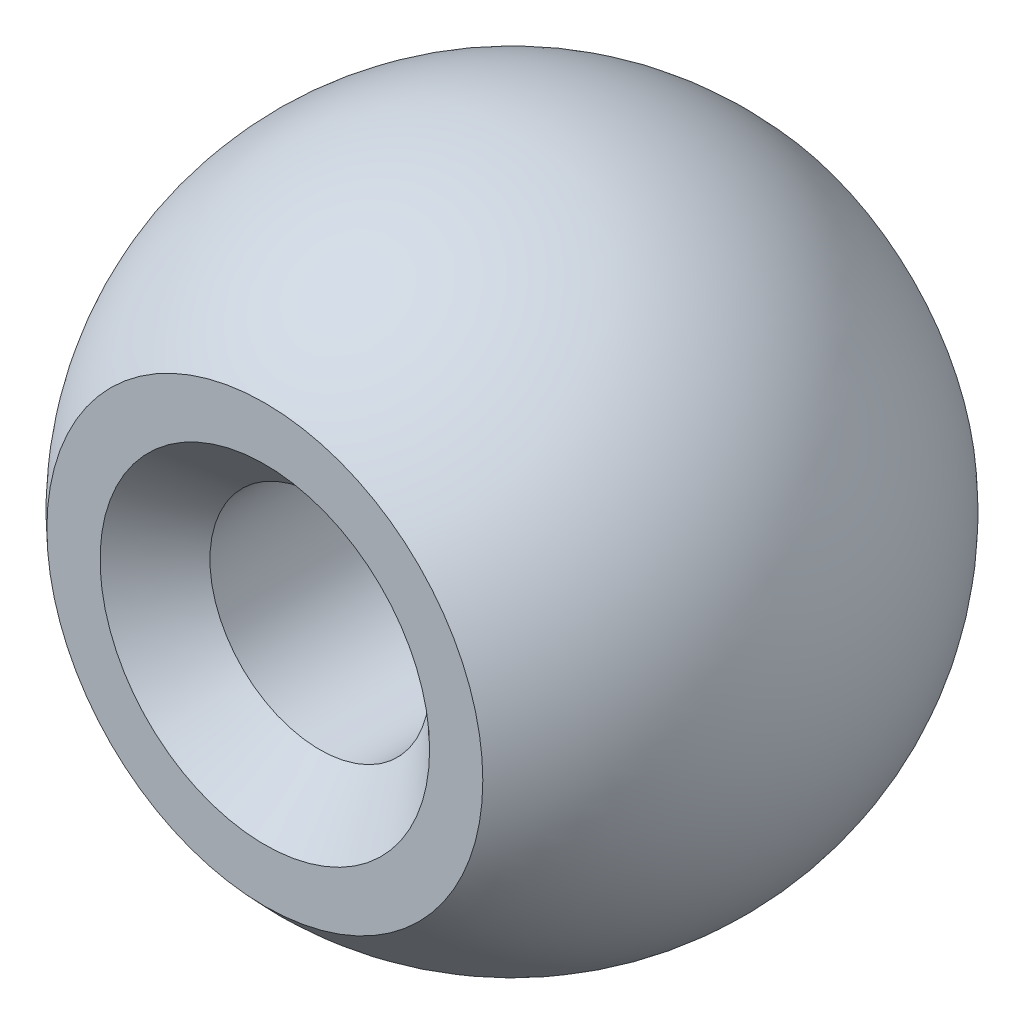
ISO-10303-21;
HEADER;
FILE_DESCRIPTION(('STEP AP214'),'2;1');
FILE_NAME('part.step','',(''),(''),'','','');
FILE_SCHEMA(('AUTOMOTIVE_DESIGN { 1 0 10303 214 1 1 1 1 }'));
ENDSEC;
DATA;
#1=APPLICATION_CONTEXT('core data for automotive mechanical design processes');
#2=APPLICATION_PROTOCOL_DEFINITION('international standard','automotive_design',2000,#1);
#3=PRODUCT_CONTEXT('',#1,'mechanical');
#4=PRODUCT('Part','Part','',(#3));
#5=PRODUCT_RELATED_PRODUCT_CATEGORY('part','',(#4));
#6=PRODUCT_DEFINITION_FORMATION('','',#4);
#7=PRODUCT_DEFINITION_CONTEXT('part definition',#1,'design');
#8=PRODUCT_DEFINITION('design','',#6,#7);
#9=PRODUCT_DEFINITION_SHAPE('','',#8);
#10=(LENGTH_UNIT() NAMED_UNIT(*) SI_UNIT(.MILLI.,.METRE.));
#11=(NAMED_UNIT(*) PLANE_ANGLE_UNIT() SI_UNIT($,.RADIAN.));
#12=(NAMED_UNIT(*) SI_UNIT($,.STERADIAN.) SOLID_ANGLE_UNIT());
#13=UNCERTAINTY_MEASURE_WITH_UNIT(LENGTH_MEASURE(1.E-05),#10,'distance_accuracy_value','');
#14=(GEOMETRIC_REPRESENTATION_CONTEXT(3) GLOBAL_UNCERTAINTY_ASSIGNED_CONTEXT((#13)) GLOBAL_UNIT_ASSIGNED_CONTEXT((#10,
#11,#12)) REPRESENTATION_CONTEXT('',''));
#15=CARTESIAN_POINT('',(0.,0.,0.));
#16=DIRECTION('',(0.,0.,1.));
#17=DIRECTION('',(1.,0.,0.));
#18=AXIS2_PLACEMENT_3D('',#15,#16,#17);
#19=CARTESIAN_POINT('',(0.,0.,0.));
#20=DIRECTION('',(0.,0.,1.));
#21=DIRECTION('',(0.,1.,0.));
#22=AXIS2_PLACEMENT_3D('',#19,#20,#21);
#23=SPHERICAL_SURFACE('',#22,6.);
#24=CARTESIAN_POINT('',(0.,-1.11022302462516E-13,4.50000000000006));
#25=DIRECTION('',(0.,0.,1.));
#26=DIRECTION('',(0.999999999999999,0.,0.));
#27=AXIS2_PLACEMENT_3D('',#24,#25,#26);
#28=CIRCLE('',#27,3.96862696659689);
#29=CARTESIAN_POINT('',(0.,3.96862696659683,4.50000000000006));
#30=VERTEX_POINT('',#29);
#31=EDGE_CURVE('E246',#30,#30,#28,.T.);
#32=CARTESIAN_POINT('',(0.,-9.99200722162641E-13,-4.50000000000084));
#33=DIRECTION('',(0.,0.,1.));
#34=DIRECTION('',(0.999999999999999,0.,0.));
#35=AXIS2_PLACEMENT_3D('',#32,#33,#34);
#36=CIRCLE('',#35,3.96862696659689);
#37=CARTESIAN_POINT('',(0.,3.96862696659595,-4.50000000000084));
#38=VERTEX_POINT('',#37);
#39=EDGE_CURVE('E252',#38,#38,#36,.T.);
#40=CARTESIAN_POINT('',(0.,3.96862696659683,4.50000000000006));
#41=CARTESIAN_POINT('',(0.,4.04813476780697,4.42988448417372));
#42=CARTESIAN_POINT('',(0.,4.12578044526494,4.35765791170537));
#43=CARTESIAN_POINT('',(0.,4.27713817883406,4.20919440386368));
#44=CARTESIAN_POINT('',(0.,4.35085023494521,4.13295746849036));
#45=CARTESIAN_POINT('',(0.,4.49413135197822,3.97668498521782));
#46=CARTESIAN_POINT('',(0.,4.56370041290008,3.89664943731861));
#47=CARTESIAN_POINT('',(0.,4.69850076282101,3.73300516695225));
#48=CARTESIAN_POINT('',(0.,4.76373205182009,3.6493964444851));
#49=CARTESIAN_POINT('',(0.,4.88967347164267,3.47884049038031));
#50=CARTESIAN_POINT('',(0.,4.95038360246618,3.39189325874267));
#51=CARTESIAN_POINT('',(0.,5.06711223105543,3.2149045454419));
#52=CARTESIAN_POINT('',(0.,5.12313072882118,3.12486306377877));
#53=CARTESIAN_POINT('',(0.,5.2303187371011,2.941938742494));
#54=CARTESIAN_POINT('',(0.,5.28148824761528,2.84905590287235));
#55=CARTESIAN_POINT('',(0.,5.37883456206924,2.66070975397012));
#56=CARTESIAN_POINT('',(0.,5.42501136600903,2.56524644468955));
#57=CARTESIAN_POINT('',(0.,5.51224256718499,2.37200748850377));
#58=CARTESIAN_POINT('',(0.,5.55329696442117,2.27423184159856));
#59=CARTESIAN_POINT('',(0.,5.63016804073471,2.07664283810147));
#60=CARTESIAN_POINT('',(0.,5.66598471981208,1.9768294815096));
#61=CARTESIAN_POINT('',(0.,5.73227975951904,1.77544540970233));
#62=CARTESIAN_POINT('',(0.,5.76275812014864,1.67387469448693));
#63=CARTESIAN_POINT('',(0.,5.81829091677103,1.4692611925633));
#64=CARTESIAN_POINT('',(0.,5.84334535276382,1.36621840585508));
#65=CARTESIAN_POINT('',(0.,5.88795992837041,1.15895018274118));
#66=CARTESIAN_POINT('',(0.,5.90752006798421,1.0547247463355));
#67=CARTESIAN_POINT('',(0.,5.94109111122113,0.845383967399413));
#68=CARTESIAN_POINT('',(0.,5.95510201484424,0.740268624869003));
#69=CARTESIAN_POINT('',(0.,5.97753523292323,0.529443276781691));
#70=CARTESIAN_POINT('',(0.,5.9859575473791,0.423733271224788));
#71=CARTESIAN_POINT('',(0.,5.99718993091751,0.21201551044506));
#72=CARTESIAN_POINT('',(0.,6.00000000000003,0.106007755222236));
#73=CARTESIAN_POINT('',(0.,6.00000000000001,-0.106007755223411));
#74=CARTESIAN_POINT('',(0.,5.99718993091746,-0.212015510446235));
#75=CARTESIAN_POINT('',(0.,5.98595754737902,-0.42373327122596));
#76=CARTESIAN_POINT('',(0.,5.97753523292313,-0.529443276782862));
#77=CARTESIAN_POINT('',(0.,5.9551020148441,-0.74026862487017));
#78=CARTESIAN_POINT('',(0.,5.94109111122096,-0.845383967400576));
#79=CARTESIAN_POINT('',(0.,5.90752006798401,-1.05472474633666));
#80=CARTESIAN_POINT('',(0.,5.88795992837018,-1.15895018274233));
#81=CARTESIAN_POINT('',(0.,5.84334535276355,-1.36621840585623));
#82=CARTESIAN_POINT('',(0.,5.81829091677074,-1.46926119256444));
#83=CARTESIAN_POINT('',(0.,5.76275812014831,-1.67387469448805));
#84=CARTESIAN_POINT('',(0.,5.73227975951869,-1.77544540970345));
#85=CARTESIAN_POINT('',(0.,5.66598471981169,-1.97682948151071));
#86=CARTESIAN_POINT('',(0.,5.6301680407343,-2.07664283810258));
#87=CARTESIAN_POINT('',(0.,5.55329696442072,-2.27423184159964));
#88=CARTESIAN_POINT('',(0.,5.51224256718453,-2.37200748850485));
#89=CARTESIAN_POINT('',(0.,5.42501136600853,-2.56524644469061));
#90=CARTESIAN_POINT('',(0.,5.37883456206872,-2.66070975397118));
#91=CARTESIAN_POINT('',(0.,5.28148824761472,-2.84905590287338));
#92=CARTESIAN_POINT('',(0.,5.23031873710052,-2.94193874249502));
#93=CARTESIAN_POINT('',(0.,5.12313072882056,-3.12486306377978));
#94=CARTESIAN_POINT('',(0.,5.0671122310548,-3.21490454544289));
#95=CARTESIAN_POINT('',(0.,4.95038360246551,-3.39189325874364));
#96=CARTESIAN_POINT('',(0.,4.88967347164199,-3.47884049038127));
#97=CARTESIAN_POINT('',(0.,4.76373205181937,-3.64939644448604));
#98=CARTESIAN_POINT('',(0.,4.69850076282028,-3.73300516695317));
#99=CARTESIAN_POINT('',(0.,4.56370041289932,-3.8966494373195));
#100=CARTESIAN_POINT('',(0.,4.49413135197744,-3.9766849852187));
#101=CARTESIAN_POINT('',(0.,4.3508502349444,-4.13295746849121));
#102=CARTESIAN_POINT('',(0.,4.27713817883323,-4.20919440386452));
#103=CARTESIAN_POINT('',(0.,4.12578044526408,-4.35765791170617));
#104=CARTESIAN_POINT('',(0.,4.0481347678061,-4.42988448417452));
#105=CARTESIAN_POINT('',(0.,3.96862696659595,-4.50000000000084));
#106=B_SPLINE_CURVE_WITH_KNOTS('',3,(#40,#41,#42,#43,#44,#45,#46,#47,#48,#49,#50,#51,#52,#53,
#54,#55,#56,#57,#58,#59,#60,#61,#62,#63,#64,#65,#66,#67,#68,#69,#70,#71,#72,#73,#74,#75,#76,#77,
#78,#79,#80,#81,#82,#83,#84,#85,#86,#87,#88,#89,#90,#91,#92,#93,#94,#95,#96,#97,#98,#99,#100,
#101,#102,#103,#104,#105),.UNSPECIFIED.,.F.,.F.,(4,2,2,2,2,2,2,2,2,2,2,2,2,2,2,2,2,2,2,2,2,2,2,
2,2,2,2,2,2,2,2,2,4),(0.,0.317986053500761,0.635972107001524,0.953958160502284,1.27194421400305,
1.58993026750381,1.90791632100457,2.22590237450533,2.54388842800609,2.86187448150685,
3.17986053500761,3.49784658850837,3.81583264200914,4.1338186955099,4.45180474901066,
4.76979080251142,5.08777685601218,5.40576290951294,5.7237489630137,6.04173501651446,
6.35972107001522,6.67770712351598,6.99569317701674,7.31367923051751,7.63166528401827,
7.94965133751903,8.26763739101979,8.58562344452055,8.90360949802131,9.22159555152207,
9.53958160502284,9.8575676585236,10.1755537120244),.UNSPECIFIED.);
#107=EDGE_CURVE('BSEAM231',#30,#38,#106,.T.);
#108=ORIENTED_EDGE('',*,*,#31,.F.);
#109=ORIENTED_EDGE('',*,*,#39,.T.);
#110=ORIENTED_EDGE('',*,*,#107,.T.);
#111=ORIENTED_EDGE('',*,*,#107,.F.);
#112=EDGE_LOOP('',(#108,#110,#109,#111));
#113=FACE_BOUND('',#112,.T.);
#114=ADVANCED_FACE('F231',(#113),#23,.T.);
#115=CARTESIAN_POINT('',(0.,3.96862696659683,4.50000000000017));
#116=DIRECTION('',(0.,0.,-1.));
#117=DIRECTION('',(-0.999999999999999,0.,0.));
#118=AXIS2_PLACEMENT_3D('',#115,#116,#117);
#119=PLANE('',#118);
#120=CARTESIAN_POINT('',(0.,-1.11022302462516E-13,4.50000000000006));
#121=DIRECTION('',(0.,0.,-1.));
#122=DIRECTION('',(-0.999999999999999,0.,0.));
#123=AXIS2_PLACEMENT_3D('',#120,#121,#122);
#124=CIRCLE('',#123,3.);
#125=CARTESIAN_POINT('',(3.00000000000166,-1.2211134881035E-12,4.50000000000006));
#126=VERTEX_POINT('',#125);
#127=EDGE_CURVE('E11',#126,#126,#124,.T.);
#128=ORIENTED_EDGE('',*,*,#127,.T.);
#129=EDGE_LOOP('',(#128));
#130=FACE_BOUND('',#129,.T.);
#131=ORIENTED_EDGE('',*,*,#31,.T.);
#132=EDGE_LOOP('',(#131));
#133=FACE_BOUND('',#132,.T.);
#134=ADVANCED_FACE('F274',(#130,#133),#119,.F.);
#135=CARTESIAN_POINT('',(0.,3.96862696659583,-4.50000000000017));
#136=DIRECTION('',(0.,0.,1.));
#137=DIRECTION('',(0.999999999999999,0.,0.));
#138=AXIS2_PLACEMENT_3D('',#135,#136,#137);
#139=PLANE('',#138);
#140=CARTESIAN_POINT('',(0.,-9.99200722162641E-13,-4.50000000000084));
#141=DIRECTION('',(0.,0.,1.));
#142=DIRECTION('',(0.999999999999999,0.,0.));
#143=AXIS2_PLACEMENT_3D('',#140,#141,#142);
#144=CIRCLE('',#143,2.);
#145=CARTESIAN_POINT('',(2.,-9.99089699860178E-13,-4.50000000000084));
#146=VERTEX_POINT('',#145);
#147=EDGE_CURVE('E256',#146,#146,#144,.T.);
#148=ORIENTED_EDGE('',*,*,#147,.T.);
#149=EDGE_LOOP('',(#148));
#150=FACE_BOUND('',#149,.T.);
#151=ORIENTED_EDGE('',*,*,#39,.F.);
#152=EDGE_LOOP('',(#151));
#153=FACE_BOUND('',#152,.T.);
#154=ADVANCED_FACE('F262',(#150,#153),#139,.F.);
#155=CARTESIAN_POINT('',(0.,-9.99200722162641E-13,-4.50000000000084));
#156=DIRECTION('',(0.,0.,1.));
#157=DIRECTION('',(0.999999999999999,0.,0.));
#158=AXIS2_PLACEMENT_3D('',#155,#156,#157);
#159=CYLINDRICAL_SURFACE('',#158,2.);
#160=CARTESIAN_POINT('',(0.,-1.22124532708767E-12,3.49999999999839));
#161=DIRECTION('',(0.,0.,-1.));
#162=DIRECTION('',(-0.999999999999999,0.,0.));
#163=AXIS2_PLACEMENT_3D('',#160,#161,#162);
#164=CIRCLE('',#163,2.);
#165=CARTESIAN_POINT('',(2.00000000000001,-9.99367255616335E-13,3.49999999999839));
#166=VERTEX_POINT('',#165);
#167=EDGE_CURVE('E238',#166,#166,#164,.F.);
#168=CARTESIAN_POINT('',(2.00000000000001,-9.99367255616335E-13,3.49999999999839));
#169=CARTESIAN_POINT('',(2.00000000000001,-9.99364364410541E-13,3.41666666666507));
#170=CARTESIAN_POINT('',(2.00000000000001,-9.99361473204748E-13,3.33333333333174));
#171=CARTESIAN_POINT('',(2.00000000000001,-9.99355690793162E-13,3.16666666666509));
#172=CARTESIAN_POINT('',(2.00000000000001,-9.99352799587368E-13,3.08333333333176));
#173=CARTESIAN_POINT('',(2.00000000000001,-9.99347017175782E-13,2.91666666666511));
#174=CARTESIAN_POINT('',(2.00000000000001,-9.99344125969988E-13,2.83333333333179));
#175=CARTESIAN_POINT('',(2.00000000000001,-9.99338343558402E-13,2.66666666666514));
#176=CARTESIAN_POINT('',(2.00000000000001,-9.99335452352609E-13,2.58333333333181));
#177=CARTESIAN_POINT('',(2.00000000000001,-9.99329669941022E-13,2.41666666666516));
#178=CARTESIAN_POINT('',(2.00000000000001,-9.99326778735229E-13,2.33333333333184));
#179=CARTESIAN_POINT('',(2.00000000000001,-9.99320996323642E-13,2.16666666666519));
#180=CARTESIAN_POINT('',(2.00000000000001,-9.99318105117849E-13,2.08333333333186));
#181=CARTESIAN_POINT('',(2.00000000000001,-9.99312322706262E-13,1.91666666666521));
#182=CARTESIAN_POINT('',(2.00000000000001,-9.99309431500469E-13,1.83333333333189));
#183=CARTESIAN_POINT('',(2.00000000000001,-9.99303649088882E-13,1.66666666666523));
#184=CARTESIAN_POINT('',(2.00000000000001,-9.99300757883089E-13,1.58333333333191));
#185=CARTESIAN_POINT('',(2.00000000000001,-9.99294975471502E-13,1.41666666666526));
#186=CARTESIAN_POINT('',(2.00000000000001,-9.99292084265709E-13,1.33333333333193));
#187=CARTESIAN_POINT('',(2.00000000000001,-9.99286301854122E-13,1.16666666666528));
#188=CARTESIAN_POINT('',(2.00000000000001,-9.99283410648329E-13,1.08333333333196));
#189=CARTESIAN_POINT('',(2.00000000000001,-9.99277628236743E-13,0.916666666665308));
#190=CARTESIAN_POINT('',(2.00000000000001,-9.99274737030949E-13,0.833333333331982));
#191=CARTESIAN_POINT('',(2.00000000000001,-9.99268954619363E-13,0.666666666665332));
#192=CARTESIAN_POINT('',(2.,-9.99266063413569E-13,0.583333333332006));
#193=CARTESIAN_POINT('',(2.,-9.99260281001983E-13,0.416666666665355));
#194=CARTESIAN_POINT('',(2.,-9.9925738979619E-13,0.33333333333203));
#195=CARTESIAN_POINT('',(2.,-9.99251607384603E-13,0.166666666665379));
#196=CARTESIAN_POINT('',(2.,-9.9924871617881E-13,0.0833333333320538));
#197=CARTESIAN_POINT('',(2.,-9.99242933767223E-13,-0.0833333333345969));
#198=CARTESIAN_POINT('',(2.,-9.9924004256143E-13,-0.166666666667922));
#199=CARTESIAN_POINT('',(2.,-9.99234260149843E-13,-0.333333333334573));
#200=CARTESIAN_POINT('',(2.,-9.9923136894405E-13,-0.416666666667898));
#201=CARTESIAN_POINT('',(2.,-9.99225586532463E-13,-0.583333333334549));
#202=CARTESIAN_POINT('',(2.,-9.9922269532667E-13,-0.666666666667874));
#203=CARTESIAN_POINT('',(2.,-9.99216912915083E-13,-0.833333333334525));
#204=CARTESIAN_POINT('',(2.,-9.9921402170929E-13,-0.91666666666785));
#205=CARTESIAN_POINT('',(2.,-9.99208239297704E-13,-1.0833333333345));
#206=CARTESIAN_POINT('',(2.,-9.9920534809191E-13,-1.16666666666783));
#207=CARTESIAN_POINT('',(2.,-9.99199565680323E-13,-1.33333333333448));
#208=CARTESIAN_POINT('',(2.,-9.9919667447453E-13,-1.4166666666678));
#209=CARTESIAN_POINT('',(2.,-9.99190892062944E-13,-1.58333333333445));
#210=CARTESIAN_POINT('',(2.,-9.9918800085715E-13,-1.66666666666778));
#211=CARTESIAN_POINT('',(2.,-9.99182218445564E-13,-1.83333333333443));
#212=CARTESIAN_POINT('',(2.,-9.9917932723977E-13,-1.91666666666775));
#213=CARTESIAN_POINT('',(2.,-9.99173544828184E-13,-2.0833333333344));
#214=CARTESIAN_POINT('',(2.,-9.99170653622391E-13,-2.16666666666773));
#215=CARTESIAN_POINT('',(2.,-9.99164871210804E-13,-2.33333333333438));
#216=CARTESIAN_POINT('',(2.,-9.99161980005011E-13,-2.41666666666771));
#217=CARTESIAN_POINT('',(2.,-9.99156197593424E-13,-2.58333333333436));
#218=CARTESIAN_POINT('',(2.,-9.99153306387631E-13,-2.66666666666768));
#219=CARTESIAN_POINT('',(2.,-9.99147523976044E-13,-2.83333333333433));
#220=CARTESIAN_POINT('',(2.,-9.99144632770251E-13,-2.91666666666766));
#221=CARTESIAN_POINT('',(2.,-9.99138850358664E-13,-3.08333333333431));
#222=CARTESIAN_POINT('',(2.,-9.99135959152871E-13,-3.16666666666763));
#223=CARTESIAN_POINT('',(2.,-9.99130176741285E-13,-3.33333333333428));
#224=CARTESIAN_POINT('',(2.,-9.99127285535491E-13,-3.41666666666761));
#225=CARTESIAN_POINT('',(2.,-9.99121503123905E-13,-3.58333333333426));
#226=CARTESIAN_POINT('',(2.,-9.99118611918111E-13,-3.66666666666759));
#227=CARTESIAN_POINT('',(2.,-9.99112829506525E-13,-3.83333333333424));
#228=CARTESIAN_POINT('',(2.,-9.99109938300732E-13,-3.91666666666756));
#229=CARTESIAN_POINT('',(2.,-9.99104155889145E-13,-4.08333333333421));
#230=CARTESIAN_POINT('',(2.,-9.99101264683352E-13,-4.16666666666754));
#231=CARTESIAN_POINT('',(2.,-9.99095482271765E-13,-4.33333333333419));
#232=CARTESIAN_POINT('',(2.,-9.99092591065972E-13,-4.41666666666751));
#233=CARTESIAN_POINT('',(2.,-9.99089699860178E-13,-4.50000000000084));
#234=B_SPLINE_CURVE_WITH_KNOTS('',3,(#168,#169,#170,#171,#172,#173,#174,#175,#176,#177,#178,
#179,#180,#181,#182,#183,#184,#185,#186,#187,#188,#189,#190,#191,#192,#193,#194,#195,#196,#197,
#198,#199,#200,#201,#202,#203,#204,#205,#206,#207,#208,#209,#210,#211,#212,#213,#214,#215,#216,
#217,#218,#219,#220,#221,#222,#223,#224,#225,#226,#227,#228,#229,#230,#231,#232,#233),
.UNSPECIFIED.,.F.,.F.,(4,2,2,2,2,2,2,2,2,2,2,2,2,2,2,2,2,2,2,2,2,2,2,2,2,2,2,2,2,2,2,2,4),(0.,
0.249999999999976,0.499999999999952,0.749999999999928,0.999999999999904,1.24999999999988,
1.49999999999986,1.74999999999983,1.99999999999981,2.24999999999978,2.49999999999976,
2.74999999999973,2.99999999999971,3.24999999999969,3.49999999999966,3.74999999999964,
3.99999999999961,4.24999999999959,4.49999999999957,4.74999999999954,4.99999999999952,
5.24999999999949,5.49999999999947,5.74999999999945,5.99999999999942,6.2499999999994,
6.49999999999938,6.74999999999935,6.99999999999933,7.2499999999993,7.49999999999928,
7.74999999999925,7.99999999999923),.UNSPECIFIED.);
#235=EDGE_CURVE('BSEAM270',#166,#146,#234,.T.);
#236=ORIENTED_EDGE('',*,*,#167,.T.);
#237=ORIENTED_EDGE('',*,*,#147,.F.);
#238=ORIENTED_EDGE('',*,*,#235,.T.);
#239=ORIENTED_EDGE('',*,*,#235,.F.);
#240=EDGE_LOOP('',(#236,#238,#237,#239));
#241=FACE_BOUND('',#240,.T.);
#242=ADVANCED_FACE('F270',(#241),#159,.F.);
#243=CARTESIAN_POINT('',(0.,-1.22124532708767E-12,3.49999999999839));
#244=DIRECTION('',(0.,0.,1.));
#245=DIRECTION('',(0.999999999999999,0.,0.));
#246=AXIS2_PLACEMENT_3D('',#243,#244,#245);
#247=CONICAL_SURFACE('',#246,2.,0.785398163397451);
#248=CARTESIAN_POINT('',(3.00000000000166,-1.2211134881035E-12,4.50000000000006));
#249=CARTESIAN_POINT('',(2.98958333333498,-1.22111370494393E-12,4.48958333333337));
#250=CARTESIAN_POINT('',(2.97916666666829,-1.22111392178437E-12,4.47916666666669));
#251=CARTESIAN_POINT('',(2.95833333333493,-1.22111435546524E-12,4.45833333333332));
#252=CARTESIAN_POINT('',(2.94791666666824,-1.22111457230567E-12,4.44791666666664));
#253=CARTESIAN_POINT('',(2.92708333333487,-1.22111500598654E-12,4.42708333333327));
#254=CARTESIAN_POINT('',(2.91666666666819,-1.22111522282697E-12,4.41666666666658));
#255=CARTESIAN_POINT('',(2.89583333333482,-1.22111565650784E-12,4.39583333333321));
#256=CARTESIAN_POINT('',(2.88541666666814,-1.22111587334828E-12,4.38541666666653));
#257=CARTESIAN_POINT('',(2.86458333333477,-1.22111630702915E-12,4.36458333333316));
#258=CARTESIAN_POINT('',(2.85416666666809,-1.22111652386958E-12,4.35416666666648));
#259=CARTESIAN_POINT('',(2.83333333333472,-1.22111695755045E-12,4.33333333333311));
#260=CARTESIAN_POINT('',(2.82291666666803,-1.22111717439088E-12,4.32291666666643));
#261=CARTESIAN_POINT('',(2.80208333333466,-1.22111760807175E-12,4.30208333333306));
#262=CARTESIAN_POINT('',(2.79166666666798,-1.22111782491219E-12,4.29166666666638));
#263=CARTESIAN_POINT('',(2.77083333333461,-1.22111825859306E-12,4.27083333333301));
#264=CARTESIAN_POINT('',(2.76041666666793,-1.22111847543349E-12,4.26041666666632));
#265=CARTESIAN_POINT('',(2.73958333333456,-1.22111890911436E-12,4.23958333333296));
#266=CARTESIAN_POINT('',(2.72916666666788,-1.22111912595479E-12,4.22916666666627));
#267=CARTESIAN_POINT('',(2.70833333333451,-1.22111955963566E-12,4.2083333333329));
#268=CARTESIAN_POINT('',(2.69791666666782,-1.2211197764761E-12,4.19791666666622));
#269=CARTESIAN_POINT('',(2.67708333333446,-1.22112021015697E-12,4.17708333333285));
#270=CARTESIAN_POINT('',(2.66666666666777,-1.2211204269974E-12,4.16666666666617));
#271=CARTESIAN_POINT('',(2.6458333333344,-1.22112086067827E-12,4.1458333333328));
#272=CARTESIAN_POINT('',(2.63541666666772,-1.22112107751871E-12,4.13541666666611));
#273=CARTESIAN_POINT('',(2.61458333333435,-1.22112151119957E-12,4.11458333333275));
#274=CARTESIAN_POINT('',(2.60416666666767,-1.22112172804001E-12,4.10416666666606));
#275=CARTESIAN_POINT('',(2.5833333333343,-1.22112216172088E-12,4.0833333333327));
#276=CARTESIAN_POINT('',(2.57291666666762,-1.22112237856131E-12,4.07291666666601));
#277=CARTESIAN_POINT('',(2.55208333333425,-1.22112281224218E-12,4.05208333333264));
#278=CARTESIAN_POINT('',(2.54166666666756,-1.22112302908262E-12,4.04166666666596));
#279=CARTESIAN_POINT('',(2.5208333333342,-1.22112346276348E-12,4.02083333333259));
#280=CARTESIAN_POINT('',(2.51041666666751,-1.22112367960392E-12,4.01041666666591));
#281=CARTESIAN_POINT('',(2.48958333333414,-1.22112411328479E-12,3.98958333333254));
#282=CARTESIAN_POINT('',(2.47916666666746,-1.22112433012522E-12,3.97916666666585));
#283=CARTESIAN_POINT('',(2.45833333333409,-1.22112476380609E-12,3.95833333333249));
#284=CARTESIAN_POINT('',(2.44791666666741,-1.22112498064653E-12,3.9479166666658));
#285=CARTESIAN_POINT('',(2.42708333333404,-1.2211254143274E-12,3.92708333333244));
#286=CARTESIAN_POINT('',(2.41666666666735,-1.22112563116783E-12,3.91666666666575));
#287=CARTESIAN_POINT('',(2.39583333333399,-1.2211260648487E-12,3.89583333333238));
#288=CARTESIAN_POINT('',(2.3854166666673,-1.22112628168913E-12,3.8854166666657));
#289=CARTESIAN_POINT('',(2.36458333333393,-1.22112671537E-12,3.86458333333233));
#290=CARTESIAN_POINT('',(2.35416666666725,-1.22112693221044E-12,3.85416666666565));
#291=CARTESIAN_POINT('',(2.33333333333388,-1.22112736589131E-12,3.83333333333228));
#292=CARTESIAN_POINT('',(2.3229166666672,-1.22112758273174E-12,3.82291666666559));
#293=CARTESIAN_POINT('',(2.30208333333383,-1.22112801641261E-12,3.80208333333223));
#294=CARTESIAN_POINT('',(2.29166666666715,-1.22112823325304E-12,3.79166666666554));
#295=CARTESIAN_POINT('',(2.27083333333378,-1.22112866693391E-12,3.77083333333217));
#296=CARTESIAN_POINT('',(2.26041666666709,-1.22112888377435E-12,3.76041666666549));
#297=CARTESIAN_POINT('',(2.23958333333373,-1.22112931745522E-12,3.73958333333212));
#298=CARTESIAN_POINT('',(2.22916666666704,-1.22112953429565E-12,3.72916666666544));
#299=CARTESIAN_POINT('',(2.20833333333367,-1.22112996797652E-12,3.70833333333207));
#300=CARTESIAN_POINT('',(2.19791666666699,-1.22113018481695E-12,3.69791666666539));
#301=CARTESIAN_POINT('',(2.17708333333362,-1.22113061849782E-12,3.67708333333202));
#302=CARTESIAN_POINT('',(2.16666666666694,-1.22113083533826E-12,3.66666666666534));
#303=CARTESIAN_POINT('',(2.14583333333357,-1.22113126901913E-12,3.64583333333197));
#304=CARTESIAN_POINT('',(2.13541666666689,-1.22113148585956E-12,3.63541666666528));
#305=CARTESIAN_POINT('',(2.11458333333352,-1.22113191954043E-12,3.61458333333192));
#306=CARTESIAN_POINT('',(2.10416666666683,-1.22113213638086E-12,3.60416666666523));
#307=CARTESIAN_POINT('',(2.08333333333347,-1.22113257006173E-12,3.58333333333186));
#308=CARTESIAN_POINT('',(2.07291666666678,-1.22113278690217E-12,3.57291666666518));
#309=CARTESIAN_POINT('',(2.05208333333341,-1.22113322058304E-12,3.55208333333181));
#310=CARTESIAN_POINT('',(2.04166666666673,-1.22113343742347E-12,3.54166666666513));
#311=CARTESIAN_POINT('',(2.02083333333336,-1.22113387110434E-12,3.52083333333176));
#312=CARTESIAN_POINT('',(2.01041666666668,-1.22113408794478E-12,3.51041666666507));
#313=CARTESIAN_POINT('',(1.99999999999999,-1.22113430478521E-12,3.49999999999839));
#314=B_SPLINE_CURVE_WITH_KNOTS('',3,(#248,#249,#250,#251,#252,#253,#254,#255,#256,#257,#258,
#259,#260,#261,#262,#263,#264,#265,#266,#267,#268,#269,#270,#271,#272,#273,#274,#275,#276,#277,
#278,#279,#280,#281,#282,#283,#284,#285,#286,#287,#288,#289,#290,#291,#292,#293,#294,#295,#296,
#297,#298,#299,#300,#301,#302,#303,#304,#305,#306,#307,#308,#309,#310,#311,#312,#313),
.UNSPECIFIED.,.F.,.F.,(4,2,2,2,2,2,2,2,2,2,2,2,2,2,2,2,2,2,2,2,2,2,2,2,2,2,2,2,2,2,2,2,4),(0.,
0.0441941738242329,0.0883883476484651,0.132582521472698,0.176776695296932,0.220970869121165,
0.265165042945397,0.30935921676963,0.353553390593863,0.397747564418096,0.441941738242329,
0.486135912066561,0.530330085890794,0.574524259715027,0.61871843353926,0.662912607363493,
0.707106781187726,0.751300955011959,0.795495128836192,0.839689302660425,0.883883476484657,
0.92807765030889,0.972271824133123,1.01646599795736,1.06066017178159,1.10485434560582,
1.14904851943005,1.19324269325429,1.23743686707852,1.28163104090275,1.32582521472699,
1.37001938855122,1.41421356237545),.UNSPECIFIED.);
#315=EDGE_CURVE('BSEAM233',#126,#166,#314,.T.);
#316=ORIENTED_EDGE('',*,*,#127,.F.);
#317=ORIENTED_EDGE('',*,*,#167,.F.);
#318=ORIENTED_EDGE('',*,*,#315,.T.);
#319=ORIENTED_EDGE('',*,*,#315,.F.);
#320=EDGE_LOOP('',(#316,#318,#317,#319));
#321=FACE_BOUND('',#320,.T.);
#322=ADVANCED_FACE('F233',(#321),#247,.F.);
#323=CLOSED_SHELL('',(#114,#134,#154,#242,#322));
#324=MANIFOLD_SOLID_BREP('B2',#323);
#325=ADVANCED_BREP_SHAPE_REPRESENTATION('',(#18,#324),#14);
#326=SHAPE_DEFINITION_REPRESENTATION(#9,#325);
ENDSEC;
END-ISO-10303-21;
